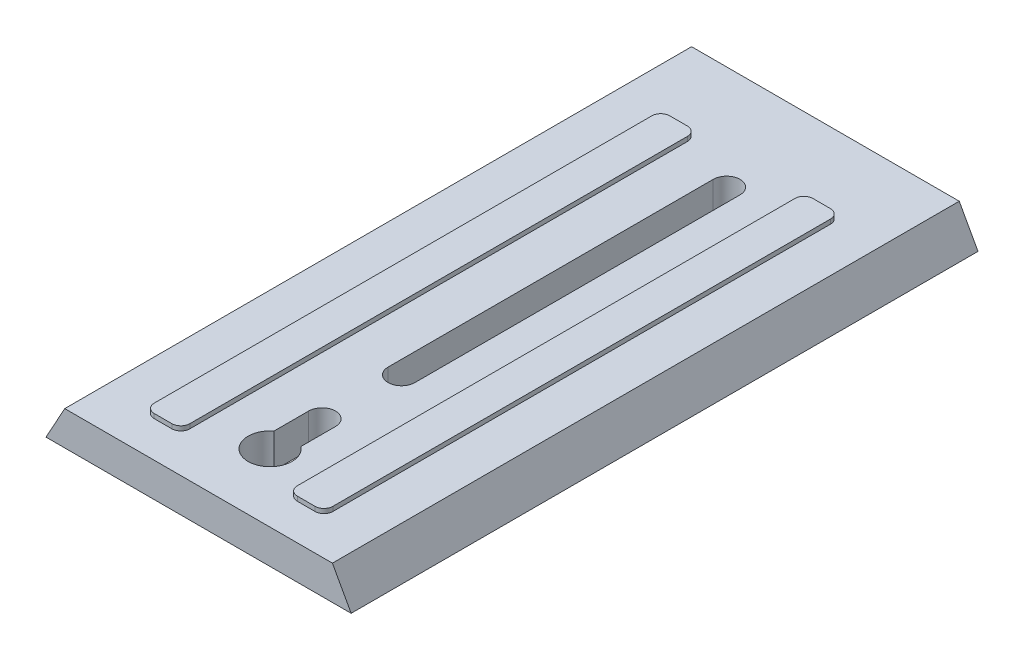
ISO-10303-21;
HEADER;
FILE_DESCRIPTION(('STEP AP214'),'2;1');
FILE_NAME('part.step','',(''),(''),'','','');
FILE_SCHEMA(('AUTOMOTIVE_DESIGN { 1 0 10303 214 1 1 1 1 }'));
ENDSEC;
DATA;
#1=APPLICATION_CONTEXT('core data for automotive mechanical design processes');
#2=APPLICATION_PROTOCOL_DEFINITION('international standard','automotive_design',2000,#1);
#3=PRODUCT_CONTEXT('',#1,'mechanical');
#4=PRODUCT('Part','Part','',(#3));
#5=PRODUCT_RELATED_PRODUCT_CATEGORY('part','',(#4));
#6=PRODUCT_DEFINITION_FORMATION('','',#4);
#7=PRODUCT_DEFINITION_CONTEXT('part definition',#1,'design');
#8=PRODUCT_DEFINITION('design','',#6,#7);
#9=PRODUCT_DEFINITION_SHAPE('','',#8);
#10=(LENGTH_UNIT() NAMED_UNIT(*) SI_UNIT(.MILLI.,.METRE.));
#11=(NAMED_UNIT(*) PLANE_ANGLE_UNIT() SI_UNIT($,.RADIAN.));
#12=(NAMED_UNIT(*) SI_UNIT($,.STERADIAN.) SOLID_ANGLE_UNIT());
#13=UNCERTAINTY_MEASURE_WITH_UNIT(LENGTH_MEASURE(1.E-05),#10,'distance_accuracy_value','');
#14=(GEOMETRIC_REPRESENTATION_CONTEXT(3) GLOBAL_UNCERTAINTY_ASSIGNED_CONTEXT((#13)) GLOBAL_UNIT_ASSIGNED_CONTEXT((#10,
#11,#12)) REPRESENTATION_CONTEXT('',''));
#15=CARTESIAN_POINT('',(0.,0.,0.));
#16=DIRECTION('',(0.,0.,1.));
#17=DIRECTION('',(1.,0.,0.));
#18=AXIS2_PLACEMENT_3D('',#15,#16,#17);
#19=CARTESIAN_POINT('',(11.6756500616298,8.61478368652415,-121.188126289698));
#20=DIRECTION('',(0.,-1.,0.));
#21=DIRECTION('',(0.,0.,-1.));
#22=AXIS2_PLACEMENT_3D('',#19,#20,#21);
#23=PLANE('',#22);
#24=DIRECTION('',(1.,0.,0.));
#25=VECTOR('',#24,1.);
#26=CARTESIAN_POINT('',(7.72886498412935,8.61478368652415,-123.188126289698));
#27=LINE('',#26,#25);
#28=CARTESIAN_POINT('',(11.6756500616298,8.61478368652415,-123.188126289698));
#29=VERTEX_POINT('',#28);
#30=CARTESIAN_POINT('',(7.72886498412934,8.61478368652415,-123.188126289698));
#31=VERTEX_POINT('',#30);
#32=EDGE_CURVE('E197',#29,#31,#27,.F.);
#33=ORIENTED_EDGE('',*,*,#32,.T.);
#34=CARTESIAN_POINT('',(7.72886498412934,8.61478368652415,-121.188126289698));
#35=DIRECTION('',(0.,-1.,0.));
#36=DIRECTION('',(0.,0.,-1.));
#37=AXIS2_PLACEMENT_3D('',#34,#35,#36);
#38=CIRCLE('',#37,2.);
#39=CARTESIAN_POINT('',(5.72886498412933,8.61478368652415,-121.188126289698));
#40=VERTEX_POINT('',#39);
#41=EDGE_CURVE('E324',#40,#31,#38,.T.);
#42=ORIENTED_EDGE('',*,*,#41,.F.);
#43=DIRECTION('',(0.,0.,-1.));
#44=VECTOR('',#43,1.);
#45=CARTESIAN_POINT('',(5.72886498412933,8.61478368652415,-121.188126289698));
#46=LINE('',#45,#44);
#47=CARTESIAN_POINT('',(5.72886498412933,8.61478368652415,-10.0480402779136));
#48=VERTEX_POINT('',#47);
#49=EDGE_CURVE('E244',#40,#48,#46,.F.);
#50=ORIENTED_EDGE('',*,*,#49,.T.);
#51=CARTESIAN_POINT('',(7.72886498412934,8.61478368652415,-10.0480402779136));
#52=DIRECTION('',(0.,-1.,0.));
#53=DIRECTION('',(0.,0.,-1.));
#54=AXIS2_PLACEMENT_3D('',#51,#52,#53);
#55=CIRCLE('',#54,2.);
#56=CARTESIAN_POINT('',(7.72886498412934,8.61478368652415,-8.04804027791362));
#57=VERTEX_POINT('',#56);
#58=EDGE_CURVE('E247',#57,#48,#55,.T.);
#59=ORIENTED_EDGE('',*,*,#58,.F.);
#60=DIRECTION('',(-1.,0.,0.));
#61=VECTOR('',#60,1.);
#62=CARTESIAN_POINT('',(7.72886498412935,8.61478368652415,-8.04804027791362));
#63=LINE('',#62,#61);
#64=CARTESIAN_POINT('',(11.6756500616298,8.61478368652415,-8.04804027791362));
#65=VERTEX_POINT('',#64);
#66=EDGE_CURVE('E248',#57,#65,#63,.F.);
#67=ORIENTED_EDGE('',*,*,#66,.T.);
#68=CARTESIAN_POINT('',(11.6756500616298,8.61478368652415,-10.0480402779136));
#69=DIRECTION('',(0.,-1.,0.));
#70=DIRECTION('',(0.,0.,-1.));
#71=AXIS2_PLACEMENT_3D('',#68,#69,#70);
#72=CIRCLE('',#71,2.);
#73=CARTESIAN_POINT('',(13.6756500616298,8.61478368652415,-10.0480402779136));
#74=VERTEX_POINT('',#73);
#75=EDGE_CURVE('E206',#74,#65,#72,.T.);
#76=ORIENTED_EDGE('',*,*,#75,.F.);
#77=DIRECTION('',(0.,0.,1.));
#78=VECTOR('',#77,1.);
#79=CARTESIAN_POINT('',(13.6756500616298,8.61478368652415,-121.188126289698));
#80=LINE('',#79,#78);
#81=CARTESIAN_POINT('',(13.6756500616298,8.61478368652415,-121.188126289698));
#82=VERTEX_POINT('',#81);
#83=EDGE_CURVE('E202',#74,#82,#80,.F.);
#84=ORIENTED_EDGE('',*,*,#83,.T.);
#85=CARTESIAN_POINT('',(11.6756500616298,8.61478368652415,-121.188126289698));
#86=DIRECTION('',(0.,-1.,0.));
#87=DIRECTION('',(0.,0.,-1.));
#88=AXIS2_PLACEMENT_3D('',#85,#86,#87);
#89=CIRCLE('',#88,2.);
#90=EDGE_CURVE('E19',#29,#82,#89,.T.);
#91=ORIENTED_EDGE('',*,*,#90,.F.);
#92=EDGE_LOOP('',(#33,#42,#50,#59,#67,#76,#84,#91));
#93=FACE_BOUND('',#92,.T.);
#94=ADVANCED_FACE('F16',(#93),#23,.F.);
#95=CARTESIAN_POINT('',(43.6393855955759,8.61478368652415,-121.188126289698));
#96=DIRECTION('',(0.,-1.,0.));
#97=DIRECTION('',(0.,0.,-1.));
#98=AXIS2_PLACEMENT_3D('',#95,#96,#97);
#99=PLANE('',#98);
#100=DIRECTION('',(1.,0.,0.));
#101=VECTOR('',#100,1.);
#102=CARTESIAN_POINT('',(43.6393855955759,8.61478368652415,-123.188126289698));
#103=LINE('',#102,#101);
#104=CARTESIAN_POINT('',(43.6393855955759,8.61478368652415,-123.188126289698));
#105=VERTEX_POINT('',#104);
#106=CARTESIAN_POINT('',(39.6926005180755,8.61478368652415,-123.188126289698));
#107=VERTEX_POINT('',#106);
#108=EDGE_CURVE('E227',#105,#107,#103,.F.);
#109=ORIENTED_EDGE('',*,*,#108,.T.);
#110=CARTESIAN_POINT('',(39.6926005180755,8.61478368652415,-121.188126289698));
#111=DIRECTION('',(0.,-1.,0.));
#112=DIRECTION('',(0.,0.,-1.));
#113=AXIS2_PLACEMENT_3D('',#110,#111,#112);
#114=CIRCLE('',#113,2.);
#115=CARTESIAN_POINT('',(37.6926005180755,8.61478368652415,-121.188126289698));
#116=VERTEX_POINT('',#115);
#117=EDGE_CURVE('E311',#116,#107,#114,.T.);
#118=ORIENTED_EDGE('',*,*,#117,.F.);
#119=DIRECTION('',(0.,0.,-1.));
#120=VECTOR('',#119,1.);
#121=CARTESIAN_POINT('',(37.6926005180755,8.61478368652415,-121.188126289698));
#122=LINE('',#121,#120);
#123=CARTESIAN_POINT('',(37.6926005180755,8.61478368652415,-10.0480402779136));
#124=VERTEX_POINT('',#123);
#125=EDGE_CURVE('E231',#116,#124,#122,.F.);
#126=ORIENTED_EDGE('',*,*,#125,.T.);
#127=CARTESIAN_POINT('',(39.6926005180755,8.61478368652415,-10.0480402779136));
#128=DIRECTION('',(0.,-1.,0.));
#129=DIRECTION('',(0.,0.,-1.));
#130=AXIS2_PLACEMENT_3D('',#127,#128,#129);
#131=CIRCLE('',#130,2.);
#132=CARTESIAN_POINT('',(39.6926005180755,8.61478368652415,-8.04804027791362));
#133=VERTEX_POINT('',#132);
#134=EDGE_CURVE('E234',#133,#124,#131,.T.);
#135=ORIENTED_EDGE('',*,*,#134,.F.);
#136=DIRECTION('',(-1.,0.,0.));
#137=VECTOR('',#136,1.);
#138=CARTESIAN_POINT('',(43.6393855955759,8.61478368652415,-8.04804027791362));
#139=LINE('',#138,#137);
#140=CARTESIAN_POINT('',(43.6393855955759,8.61478368652415,-8.04804027791362));
#141=VERTEX_POINT('',#140);
#142=EDGE_CURVE('E235',#133,#141,#139,.F.);
#143=ORIENTED_EDGE('',*,*,#142,.T.);
#144=CARTESIAN_POINT('',(43.6393855955759,8.61478368652415,-10.0480402779136));
#145=DIRECTION('',(0.,-1.,0.));
#146=DIRECTION('',(0.,0.,-1.));
#147=AXIS2_PLACEMENT_3D('',#144,#145,#146);
#148=CIRCLE('',#147,2.);
#149=CARTESIAN_POINT('',(45.6393855955759,8.61478368652415,-10.0480402779136));
#150=VERTEX_POINT('',#149);
#151=EDGE_CURVE('E238',#150,#141,#148,.T.);
#152=ORIENTED_EDGE('',*,*,#151,.F.);
#153=DIRECTION('',(0.,0.,1.));
#154=VECTOR('',#153,1.);
#155=CARTESIAN_POINT('',(45.6393855955759,8.61478368652415,-121.188126289698));
#156=LINE('',#155,#154);
#157=CARTESIAN_POINT('',(45.6393855955759,8.61478368652415,-121.188126289698));
#158=VERTEX_POINT('',#157);
#159=EDGE_CURVE('E239',#150,#158,#156,.F.);
#160=ORIENTED_EDGE('',*,*,#159,.T.);
#161=CARTESIAN_POINT('',(43.6393855955759,8.61478368652415,-121.188126289698));
#162=DIRECTION('',(0.,-1.,0.));
#163=DIRECTION('',(0.,0.,-1.));
#164=AXIS2_PLACEMENT_3D('',#161,#162,#163);
#165=CIRCLE('',#164,2.);
#166=EDGE_CURVE('E242',#105,#158,#165,.T.);
#167=ORIENTED_EDGE('',*,*,#166,.F.);
#168=EDGE_LOOP('',(#109,#118,#126,#135,#143,#152,#160,#167));
#169=FACE_BOUND('',#168,.T.);
#170=ADVANCED_FACE('F728',(#169),#99,.F.);
#171=CARTESIAN_POINT('',(7.72886498412935,8.61478368652415,-123.188126289698));
#172=DIRECTION('',(0.,0.,1.));
#173=DIRECTION('',(1.,0.,0.));
#174=AXIS2_PLACEMENT_3D('',#171,#172,#173);
#175=PLANE('',#174);
#176=DIRECTION('',(0.,-1.,0.));
#177=VECTOR('',#176,1.);
#178=CARTESIAN_POINT('',(7.72886498412934,8.61478368652415,-123.188126289698));
#179=LINE('',#178,#177);
#180=CARTESIAN_POINT('',(7.72886498412934,7.61478368652415,-123.188126289698));
#181=VERTEX_POINT('',#180);
#182=EDGE_CURVE('E230',#31,#181,#179,.T.);
#183=ORIENTED_EDGE('',*,*,#182,.F.);
#184=ORIENTED_EDGE('',*,*,#32,.F.);
#185=DIRECTION('',(0.,-1.,0.));
#186=VECTOR('',#185,1.);
#187=CARTESIAN_POINT('',(11.6756500616298,8.61478368652415,-123.188126289698));
#188=LINE('',#187,#186);
#189=CARTESIAN_POINT('',(11.6756500616298,7.61478368652415,-123.188126289698));
#190=VERTEX_POINT('',#189);
#191=EDGE_CURVE('E216',#190,#29,#188,.F.);
#192=ORIENTED_EDGE('',*,*,#191,.F.);
#193=DIRECTION('',(1.,0.,0.));
#194=VECTOR('',#193,1.);
#195=CARTESIAN_POINT('',(-4.20551489691764,7.61478368652415,-123.188126289698));
#196=LINE('',#195,#194);
#197=EDGE_CURVE('E310',#181,#190,#196,.T.);
#198=ORIENTED_EDGE('',*,*,#197,.F.);
#199=EDGE_LOOP('',(#183,#184,#192,#198));
#200=FACE_BOUND('',#199,.T.);
#201=ADVANCED_FACE('F719',(#200),#175,.F.);
#202=CARTESIAN_POINT('',(11.6756500616298,8.61478368652415,-121.188126289698));
#203=DIRECTION('',(0.,-1.,0.));
#204=DIRECTION('',(0.,0.,-1.));
#205=AXIS2_PLACEMENT_3D('',#202,#203,#204);
#206=CYLINDRICAL_SURFACE('',#205,2.);
#207=ORIENTED_EDGE('',*,*,#90,.T.);
#208=DIRECTION('',(0.,1.,0.));
#209=VECTOR('',#208,1.);
#210=CARTESIAN_POINT('',(13.6756500616298,8.61478368652415,-121.188126289698));
#211=LINE('',#210,#209);
#212=CARTESIAN_POINT('',(13.6756500616298,7.61478368652415,-121.188126289698));
#213=VERTEX_POINT('',#212);
#214=EDGE_CURVE('E210',#82,#213,#211,.F.);
#215=ORIENTED_EDGE('',*,*,#214,.T.);
#216=CARTESIAN_POINT('',(11.6756500616298,7.61478368652415,-121.188126289698));
#217=DIRECTION('',(0.,-1.,0.));
#218=DIRECTION('',(0.,0.,-1.));
#219=AXIS2_PLACEMENT_3D('',#216,#217,#218);
#220=CIRCLE('',#219,2.);
#221=EDGE_CURVE('E308',#190,#213,#220,.T.);
#222=ORIENTED_EDGE('',*,*,#221,.F.);
#223=ORIENTED_EDGE('',*,*,#191,.T.);
#224=EDGE_LOOP('',(#207,#215,#222,#223));
#225=FACE_BOUND('',#224,.T.);
#226=ADVANCED_FACE('F213',(#225),#206,.T.);
#227=CARTESIAN_POINT('',(13.6756500616298,8.61478368652415,-121.188126289698));
#228=DIRECTION('',(-1.,0.,0.));
#229=DIRECTION('',(0.,0.,1.));
#230=AXIS2_PLACEMENT_3D('',#227,#228,#229);
#231=PLANE('',#230);
#232=ORIENTED_EDGE('',*,*,#214,.F.);
#233=ORIENTED_EDGE('',*,*,#83,.F.);
#234=DIRECTION('',(0.,-1.,0.));
#235=VECTOR('',#234,1.);
#236=CARTESIAN_POINT('',(13.6756500616298,8.61478368652415,-10.0480402779136));
#237=LINE('',#236,#235);
#238=CARTESIAN_POINT('',(13.6756500616298,7.61478368652415,-10.0480402779136));
#239=VERTEX_POINT('',#238);
#240=EDGE_CURVE('E221',#239,#74,#237,.F.);
#241=ORIENTED_EDGE('',*,*,#240,.F.);
#242=DIRECTION('',(0.,0.,1.));
#243=VECTOR('',#242,1.);
#244=CARTESIAN_POINT('',(13.6756500616298,7.61478368652415,-140.));
#245=LINE('',#244,#243);
#246=EDGE_CURVE('E219',#213,#239,#245,.T.);
#247=ORIENTED_EDGE('',*,*,#246,.F.);
#248=EDGE_LOOP('',(#232,#233,#241,#247));
#249=FACE_BOUND('',#248,.T.);
#250=ADVANCED_FACE('F217',(#249),#231,.F.);
#251=CARTESIAN_POINT('',(11.6756500616298,8.61478368652415,-10.0480402779136));
#252=DIRECTION('',(0.,-1.,0.));
#253=DIRECTION('',(0.,0.,-1.));
#254=AXIS2_PLACEMENT_3D('',#251,#252,#253);
#255=CYLINDRICAL_SURFACE('',#254,2.);
#256=ORIENTED_EDGE('',*,*,#75,.T.);
#257=DIRECTION('',(0.,1.,0.));
#258=VECTOR('',#257,1.);
#259=CARTESIAN_POINT('',(11.6756500616298,8.61478368652415,-8.04804027791362));
#260=LINE('',#259,#258);
#261=CARTESIAN_POINT('',(11.6756500616298,7.61478368652415,-8.04804027791362));
#262=VERTEX_POINT('',#261);
#263=EDGE_CURVE('E249',#65,#262,#260,.F.);
#264=ORIENTED_EDGE('',*,*,#263,.T.);
#265=CARTESIAN_POINT('',(11.6756500616298,7.61478368652415,-10.0480402779136));
#266=DIRECTION('',(0.,-1.,0.));
#267=DIRECTION('',(0.,0.,-1.));
#268=AXIS2_PLACEMENT_3D('',#265,#266,#267);
#269=CIRCLE('',#268,2.);
#270=EDGE_CURVE('E305',#239,#262,#269,.T.);
#271=ORIENTED_EDGE('',*,*,#270,.F.);
#272=ORIENTED_EDGE('',*,*,#240,.T.);
#273=EDGE_LOOP('',(#256,#264,#271,#272));
#274=FACE_BOUND('',#273,.T.);
#275=ADVANCED_FACE('F332',(#274),#255,.T.);
#276=CARTESIAN_POINT('',(7.72886498412935,8.61478368652415,-8.04804027791362));
#277=DIRECTION('',(0.,0.,-1.));
#278=DIRECTION('',(-1.,0.,0.));
#279=AXIS2_PLACEMENT_3D('',#276,#277,#278);
#280=PLANE('',#279);
#281=ORIENTED_EDGE('',*,*,#263,.F.);
#282=ORIENTED_EDGE('',*,*,#66,.F.);
#283=DIRECTION('',(0.,-1.,0.));
#284=VECTOR('',#283,1.);
#285=CARTESIAN_POINT('',(7.72886498412935,8.61478368652415,-8.04804027791362));
#286=LINE('',#285,#284);
#287=CARTESIAN_POINT('',(7.72886498412934,7.61478368652415,-8.04804027791362));
#288=VERTEX_POINT('',#287);
#289=EDGE_CURVE('E329',#288,#57,#286,.F.);
#290=ORIENTED_EDGE('',*,*,#289,.F.);
#291=DIRECTION('',(1.,0.,0.));
#292=VECTOR('',#291,1.);
#293=CARTESIAN_POINT('',(-4.20551489691764,7.61478368652415,-8.04804027791361));
#294=LINE('',#293,#292);
#295=EDGE_CURVE('E304',#262,#288,#294,.F.);
#296=ORIENTED_EDGE('',*,*,#295,.F.);
#297=EDGE_LOOP('',(#281,#282,#290,#296));
#298=FACE_BOUND('',#297,.T.);
#299=ADVANCED_FACE('F336',(#298),#280,.F.);
#300=CARTESIAN_POINT('',(7.72886498412934,8.61478368652415,-10.0480402779136));
#301=DIRECTION('',(0.,-1.,0.));
#302=DIRECTION('',(0.,0.,-1.));
#303=AXIS2_PLACEMENT_3D('',#300,#301,#302);
#304=CYLINDRICAL_SURFACE('',#303,2.);
#305=ORIENTED_EDGE('',*,*,#58,.T.);
#306=DIRECTION('',(0.,1.,0.));
#307=VECTOR('',#306,1.);
#308=CARTESIAN_POINT('',(5.72886498412933,8.61478368652415,-10.0480402779136));
#309=LINE('',#308,#307);
#310=CARTESIAN_POINT('',(5.72886498412933,7.61478368652415,-10.0480402779136));
#311=VERTEX_POINT('',#310);
#312=EDGE_CURVE('E246',#48,#311,#309,.F.);
#313=ORIENTED_EDGE('',*,*,#312,.T.);
#314=CARTESIAN_POINT('',(7.72886498412934,7.61478368652415,-10.0480402779136));
#315=DIRECTION('',(0.,-1.,0.));
#316=DIRECTION('',(0.,0.,-1.));
#317=AXIS2_PLACEMENT_3D('',#314,#315,#316);
#318=CIRCLE('',#317,2.);
#319=EDGE_CURVE('E301',#288,#311,#318,.T.);
#320=ORIENTED_EDGE('',*,*,#319,.F.);
#321=ORIENTED_EDGE('',*,*,#289,.T.);
#322=EDGE_LOOP('',(#305,#313,#320,#321));
#323=FACE_BOUND('',#322,.T.);
#324=ADVANCED_FACE('F676',(#323),#304,.T.);
#325=CARTESIAN_POINT('',(5.72886498412933,8.61478368652415,-121.188126289698));
#326=DIRECTION('',(1.,0.,0.));
#327=DIRECTION('',(0.,0.,-1.));
#328=AXIS2_PLACEMENT_3D('',#325,#326,#327);
#329=PLANE('',#328);
#330=ORIENTED_EDGE('',*,*,#312,.F.);
#331=ORIENTED_EDGE('',*,*,#49,.F.);
#332=DIRECTION('',(0.,-1.,0.));
#333=VECTOR('',#332,1.);
#334=CARTESIAN_POINT('',(5.72886498412933,8.61478368652415,-121.188126289698));
#335=LINE('',#334,#333);
#336=CARTESIAN_POINT('',(5.72886498412933,7.61478368652415,-121.188126289698));
#337=VERTEX_POINT('',#336);
#338=EDGE_CURVE('E327',#337,#40,#335,.F.);
#339=ORIENTED_EDGE('',*,*,#338,.F.);
#340=DIRECTION('',(0.,0.,1.));
#341=VECTOR('',#340,1.);
#342=CARTESIAN_POINT('',(5.72886498412933,7.61478368652415,-140.));
#343=LINE('',#342,#341);
#344=EDGE_CURVE('E300',#311,#337,#343,.F.);
#345=ORIENTED_EDGE('',*,*,#344,.F.);
#346=EDGE_LOOP('',(#330,#331,#339,#345));
#347=FACE_BOUND('',#346,.T.);
#348=ADVANCED_FACE('F666',(#347),#329,.F.);
#349=CARTESIAN_POINT('',(7.72886498412934,8.61478368652415,-121.188126289698));
#350=DIRECTION('',(0.,-1.,0.));
#351=DIRECTION('',(0.,0.,-1.));
#352=AXIS2_PLACEMENT_3D('',#349,#350,#351);
#353=CYLINDRICAL_SURFACE('',#352,2.);
#354=ORIENTED_EDGE('',*,*,#41,.T.);
#355=ORIENTED_EDGE('',*,*,#182,.T.);
#356=CARTESIAN_POINT('',(7.72886498412934,7.61478368652415,-121.188126289698));
#357=DIRECTION('',(0.,-1.,0.));
#358=DIRECTION('',(0.,0.,-1.));
#359=AXIS2_PLACEMENT_3D('',#356,#357,#358);
#360=CIRCLE('',#359,2.);
#361=EDGE_CURVE('E297',#337,#181,#360,.T.);
#362=ORIENTED_EDGE('',*,*,#361,.F.);
#363=ORIENTED_EDGE('',*,*,#338,.T.);
#364=EDGE_LOOP('',(#354,#355,#362,#363));
#365=FACE_BOUND('',#364,.T.);
#366=ADVANCED_FACE('F656',(#365),#353,.T.);
#367=CARTESIAN_POINT('',(43.6393855955759,8.61478368652415,-123.188126289698));
#368=DIRECTION('',(0.,0.,1.));
#369=DIRECTION('',(1.,0.,0.));
#370=AXIS2_PLACEMENT_3D('',#367,#368,#369);
#371=PLANE('',#370);
#372=DIRECTION('',(0.,-1.,0.));
#373=VECTOR('',#372,1.);
#374=CARTESIAN_POINT('',(39.6926005180755,8.61478368652415,-123.188126289698));
#375=LINE('',#374,#373);
#376=CARTESIAN_POINT('',(39.6926005180755,7.61478368652415,-123.188126289698));
#377=VERTEX_POINT('',#376);
#378=EDGE_CURVE('E314',#107,#377,#375,.T.);
#379=ORIENTED_EDGE('',*,*,#378,.F.);
#380=ORIENTED_EDGE('',*,*,#108,.F.);
#381=DIRECTION('',(0.,-1.,0.));
#382=VECTOR('',#381,1.);
#383=CARTESIAN_POINT('',(43.6393855955759,8.61478368652415,-123.188126289698));
#384=LINE('',#383,#382);
#385=CARTESIAN_POINT('',(43.6393855955759,7.61478368652415,-123.188126289698));
#386=VERTEX_POINT('',#385);
#387=EDGE_CURVE('E229',#386,#105,#384,.F.);
#388=ORIENTED_EDGE('',*,*,#387,.F.);
#389=DIRECTION('',(1.,0.,0.));
#390=VECTOR('',#389,1.);
#391=CARTESIAN_POINT('',(-4.20551489691764,7.61478368652415,-123.188126289698));
#392=LINE('',#391,#390);
#393=EDGE_CURVE('E296',#377,#386,#392,.T.);
#394=ORIENTED_EDGE('',*,*,#393,.F.);
#395=EDGE_LOOP('',(#379,#380,#388,#394));
#396=FACE_BOUND('',#395,.T.);
#397=ADVANCED_FACE('F646',(#396),#371,.F.);
#398=CARTESIAN_POINT('',(43.6393855955759,8.61478368652415,-121.188126289698));
#399=DIRECTION('',(0.,-1.,0.));
#400=DIRECTION('',(0.,0.,-1.));
#401=AXIS2_PLACEMENT_3D('',#398,#399,#400);
#402=CYLINDRICAL_SURFACE('',#401,2.);
#403=ORIENTED_EDGE('',*,*,#166,.T.);
#404=DIRECTION('',(0.,1.,0.));
#405=VECTOR('',#404,1.);
#406=CARTESIAN_POINT('',(45.6393855955759,8.61478368652415,-121.188126289698));
#407=LINE('',#406,#405);
#408=CARTESIAN_POINT('',(45.6393855955759,7.61478368652415,-121.188126289698));
#409=VERTEX_POINT('',#408);
#410=EDGE_CURVE('E241',#158,#409,#407,.F.);
#411=ORIENTED_EDGE('',*,*,#410,.T.);
#412=CARTESIAN_POINT('',(43.6393855955759,7.61478368652415,-121.188126289698));
#413=DIRECTION('',(0.,-1.,0.));
#414=DIRECTION('',(0.,0.,-1.));
#415=AXIS2_PLACEMENT_3D('',#412,#413,#414);
#416=CIRCLE('',#415,2.);
#417=EDGE_CURVE('E293',#386,#409,#416,.T.);
#418=ORIENTED_EDGE('',*,*,#417,.F.);
#419=ORIENTED_EDGE('',*,*,#387,.T.);
#420=EDGE_LOOP('',(#403,#411,#418,#419));
#421=FACE_BOUND('',#420,.T.);
#422=ADVANCED_FACE('F636',(#421),#402,.T.);
#423=CARTESIAN_POINT('',(45.6393855955759,8.61478368652415,-121.188126289698));
#424=DIRECTION('',(-1.,0.,0.));
#425=DIRECTION('',(0.,0.,1.));
#426=AXIS2_PLACEMENT_3D('',#423,#424,#425);
#427=PLANE('',#426);
#428=ORIENTED_EDGE('',*,*,#410,.F.);
#429=ORIENTED_EDGE('',*,*,#159,.F.);
#430=DIRECTION('',(0.,-1.,0.));
#431=VECTOR('',#430,1.);
#432=CARTESIAN_POINT('',(45.6393855955759,8.61478368652415,-10.0480402779136));
#433=LINE('',#432,#431);
#434=CARTESIAN_POINT('',(45.6393855955759,7.61478368652415,-10.0480402779136));
#435=VERTEX_POINT('',#434);
#436=EDGE_CURVE('E321',#435,#150,#433,.F.);
#437=ORIENTED_EDGE('',*,*,#436,.F.);
#438=DIRECTION('',(0.,0.,1.));
#439=VECTOR('',#438,1.);
#440=CARTESIAN_POINT('',(45.6393855955759,7.61478368652415,-140.));
#441=LINE('',#440,#439);
#442=EDGE_CURVE('E292',#409,#435,#441,.T.);
#443=ORIENTED_EDGE('',*,*,#442,.F.);
#444=EDGE_LOOP('',(#428,#429,#437,#443));
#445=FACE_BOUND('',#444,.T.);
#446=ADVANCED_FACE('F626',(#445),#427,.F.);
#447=CARTESIAN_POINT('',(43.6393855955759,8.61478368652415,-10.0480402779136));
#448=DIRECTION('',(0.,-1.,0.));
#449=DIRECTION('',(0.,0.,-1.));
#450=AXIS2_PLACEMENT_3D('',#447,#448,#449);
#451=CYLINDRICAL_SURFACE('',#450,2.);
#452=ORIENTED_EDGE('',*,*,#151,.T.);
#453=DIRECTION('',(0.,1.,0.));
#454=VECTOR('',#453,1.);
#455=CARTESIAN_POINT('',(43.6393855955759,8.61478368652415,-8.04804027791362));
#456=LINE('',#455,#454);
#457=CARTESIAN_POINT('',(43.6393855955759,7.61478368652415,-8.04804027791362));
#458=VERTEX_POINT('',#457);
#459=EDGE_CURVE('E237',#141,#458,#456,.F.);
#460=ORIENTED_EDGE('',*,*,#459,.T.);
#461=CARTESIAN_POINT('',(43.6393855955759,7.61478368652415,-10.0480402779136));
#462=DIRECTION('',(0.,-1.,0.));
#463=DIRECTION('',(0.,0.,-1.));
#464=AXIS2_PLACEMENT_3D('',#461,#462,#463);
#465=CIRCLE('',#464,2.);
#466=EDGE_CURVE('E289',#435,#458,#465,.T.);
#467=ORIENTED_EDGE('',*,*,#466,.F.);
#468=ORIENTED_EDGE('',*,*,#436,.T.);
#469=EDGE_LOOP('',(#452,#460,#467,#468));
#470=FACE_BOUND('',#469,.T.);
#471=ADVANCED_FACE('F616',(#470),#451,.T.);
#472=CARTESIAN_POINT('',(43.6393855955759,8.61478368652415,-8.04804027791362));
#473=DIRECTION('',(0.,0.,-1.));
#474=DIRECTION('',(-1.,0.,0.));
#475=AXIS2_PLACEMENT_3D('',#472,#473,#474);
#476=PLANE('',#475);
#477=ORIENTED_EDGE('',*,*,#459,.F.);
#478=ORIENTED_EDGE('',*,*,#142,.F.);
#479=DIRECTION('',(0.,-1.,0.));
#480=VECTOR('',#479,1.);
#481=CARTESIAN_POINT('',(39.6926005180755,8.61478368652415,-8.04804027791362));
#482=LINE('',#481,#480);
#483=CARTESIAN_POINT('',(39.6926005180755,7.61478368652415,-8.04804027791362));
#484=VERTEX_POINT('',#483);
#485=EDGE_CURVE('E318',#484,#133,#482,.F.);
#486=ORIENTED_EDGE('',*,*,#485,.F.);
#487=DIRECTION('',(1.,0.,0.));
#488=VECTOR('',#487,1.);
#489=CARTESIAN_POINT('',(-4.20551489691764,7.61478368652415,-8.04804027791361));
#490=LINE('',#489,#488);
#491=EDGE_CURVE('E288',#458,#484,#490,.F.);
#492=ORIENTED_EDGE('',*,*,#491,.F.);
#493=EDGE_LOOP('',(#477,#478,#486,#492));
#494=FACE_BOUND('',#493,.T.);
#495=ADVANCED_FACE('F606',(#494),#476,.F.);
#496=CARTESIAN_POINT('',(39.6926005180755,8.61478368652415,-10.0480402779136));
#497=DIRECTION('',(0.,-1.,0.));
#498=DIRECTION('',(0.,0.,-1.));
#499=AXIS2_PLACEMENT_3D('',#496,#497,#498);
#500=CYLINDRICAL_SURFACE('',#499,2.);
#501=ORIENTED_EDGE('',*,*,#134,.T.);
#502=DIRECTION('',(0.,1.,0.));
#503=VECTOR('',#502,1.);
#504=CARTESIAN_POINT('',(37.6926005180755,8.61478368652415,-10.0480402779136));
#505=LINE('',#504,#503);
#506=CARTESIAN_POINT('',(37.6926005180755,7.61478368652415,-10.0480402779136));
#507=VERTEX_POINT('',#506);
#508=EDGE_CURVE('E233',#124,#507,#505,.F.);
#509=ORIENTED_EDGE('',*,*,#508,.T.);
#510=CARTESIAN_POINT('',(39.6926005180755,7.61478368652415,-10.0480402779136));
#511=DIRECTION('',(0.,-1.,0.));
#512=DIRECTION('',(0.,0.,-1.));
#513=AXIS2_PLACEMENT_3D('',#510,#511,#512);
#514=CIRCLE('',#513,2.);
#515=EDGE_CURVE('E285',#484,#507,#514,.T.);
#516=ORIENTED_EDGE('',*,*,#515,.F.);
#517=ORIENTED_EDGE('',*,*,#485,.T.);
#518=EDGE_LOOP('',(#501,#509,#516,#517));
#519=FACE_BOUND('',#518,.T.);
#520=ADVANCED_FACE('F596',(#519),#500,.T.);
#521=CARTESIAN_POINT('',(37.6926005180755,8.61478368652415,-121.188126289698));
#522=DIRECTION('',(1.,0.,0.));
#523=DIRECTION('',(0.,0.,-1.));
#524=AXIS2_PLACEMENT_3D('',#521,#522,#523);
#525=PLANE('',#524);
#526=ORIENTED_EDGE('',*,*,#508,.F.);
#527=ORIENTED_EDGE('',*,*,#125,.F.);
#528=DIRECTION('',(0.,-1.,0.));
#529=VECTOR('',#528,1.);
#530=CARTESIAN_POINT('',(37.6926005180755,8.61478368652415,-121.188126289698));
#531=LINE('',#530,#529);
#532=CARTESIAN_POINT('',(37.6926005180755,7.61478368652415,-121.188126289698));
#533=VERTEX_POINT('',#532);
#534=EDGE_CURVE('E315',#533,#116,#531,.F.);
#535=ORIENTED_EDGE('',*,*,#534,.F.);
#536=DIRECTION('',(0.,0.,1.));
#537=VECTOR('',#536,1.);
#538=CARTESIAN_POINT('',(37.6926005180755,7.61478368652415,-140.));
#539=LINE('',#538,#537);
#540=EDGE_CURVE('E284',#507,#533,#539,.F.);
#541=ORIENTED_EDGE('',*,*,#540,.F.);
#542=EDGE_LOOP('',(#526,#527,#535,#541));
#543=FACE_BOUND('',#542,.T.);
#544=ADVANCED_FACE('F586',(#543),#525,.F.);
#545=CARTESIAN_POINT('',(39.6926005180755,8.61478368652415,-121.188126289698));
#546=DIRECTION('',(0.,-1.,0.));
#547=DIRECTION('',(0.,0.,-1.));
#548=AXIS2_PLACEMENT_3D('',#545,#546,#547);
#549=CYLINDRICAL_SURFACE('',#548,2.);
#550=ORIENTED_EDGE('',*,*,#117,.T.);
#551=ORIENTED_EDGE('',*,*,#378,.T.);
#552=CARTESIAN_POINT('',(39.6926005180755,7.61478368652415,-121.188126289698));
#553=DIRECTION('',(0.,-1.,0.));
#554=DIRECTION('',(0.,0.,-1.));
#555=AXIS2_PLACEMENT_3D('',#552,#553,#554);
#556=CIRCLE('',#555,2.);
#557=EDGE_CURVE('E281',#533,#377,#556,.T.);
#558=ORIENTED_EDGE('',*,*,#557,.F.);
#559=ORIENTED_EDGE('',*,*,#534,.T.);
#560=EDGE_LOOP('',(#550,#551,#558,#559));
#561=FACE_BOUND('',#560,.T.);
#562=ADVANCED_FACE('F576',(#561),#549,.T.);
#563=CARTESIAN_POINT('',(-4.20551489691764,7.61478368652415,-140.));
#564=DIRECTION('',(0.,1.,0.));
#565=DIRECTION('',(0.,0.,1.));
#566=AXIS2_PLACEMENT_3D('',#563,#564,#565);
#567=PLANE('',#566);
#568=ORIENTED_EDGE('',*,*,#540,.T.);
#569=ORIENTED_EDGE('',*,*,#557,.T.);
#570=ORIENTED_EDGE('',*,*,#393,.T.);
#571=ORIENTED_EDGE('',*,*,#417,.T.);
#572=ORIENTED_EDGE('',*,*,#442,.T.);
#573=ORIENTED_EDGE('',*,*,#466,.T.);
#574=ORIENTED_EDGE('',*,*,#491,.T.);
#575=ORIENTED_EDGE('',*,*,#515,.T.);
#576=EDGE_LOOP('',(#568,#569,#570,#571,#572,#573,#574,#575));
#577=FACE_BOUND('',#576,.T.);
#578=DIRECTION('',(1.,0.,0.));
#579=VECTOR('',#578,1.);
#580=CARTESIAN_POINT('',(-8.39219961160897,7.61478368652415,-140.));
#581=LINE('',#580,#579);
#582=CARTESIAN_POINT('',(55.5737654766229,7.61478368652415,-140.));
#583=VERTEX_POINT('',#582);
#584=CARTESIAN_POINT('',(-4.20551489691764,7.61478368652415,-140.));
#585=VERTEX_POINT('',#584);
#586=EDGE_CURVE('E407',#583,#585,#581,.F.);
#587=ORIENTED_EDGE('',*,*,#586,.T.);
#588=DIRECTION('',(0.,0.,1.));
#589=VECTOR('',#588,1.);
#590=CARTESIAN_POINT('',(-4.20551489691764,7.61478368652415,-140.));
#591=LINE('',#590,#589);
#592=CARTESIAN_POINT('',(-4.20551489691764,7.61478368652415,0.));
#593=VERTEX_POINT('',#592);
#594=EDGE_CURVE('E404',#593,#585,#591,.F.);
#595=ORIENTED_EDGE('',*,*,#594,.F.);
#596=DIRECTION('',(1.,0.,0.));
#597=VECTOR('',#596,1.);
#598=CARTESIAN_POINT('',(-8.39219961160897,7.61478368652415,0.));
#599=LINE('',#598,#597);
#600=CARTESIAN_POINT('',(55.5737654766229,7.61478368652415,0.));
#601=VERTEX_POINT('',#600);
#602=EDGE_CURVE('E372',#601,#593,#599,.F.);
#603=ORIENTED_EDGE('',*,*,#602,.F.);
#604=DIRECTION('',(0.,0.,1.));
#605=VECTOR('',#604,1.);
#606=CARTESIAN_POINT('',(55.5737654766229,7.61478368652415,-140.));
#607=LINE('',#606,#605);
#608=EDGE_CURVE('E265',#583,#601,#607,.T.);
#609=ORIENTED_EDGE('',*,*,#608,.F.);
#610=EDGE_LOOP('',(#587,#595,#603,#609));
#611=FACE_BOUND('',#610,.T.);
#612=CARTESIAN_POINT('',(26.5,7.61478368652415,-26.7671340160257));
#613=DIRECTION('',(0.,-1.,0.));
#614=DIRECTION('',(0.,0.,-1.));
#615=AXIS2_PLACEMENT_3D('',#612,#613,#614);
#616=CIRCLE('',#615,3.);
#617=CARTESIAN_POINT('',(23.5,7.61478368652416,-26.7671340160257));
#618=VERTEX_POINT('',#617);
#619=CARTESIAN_POINT('',(29.5,7.61478368652416,-26.7671340160257));
#620=VERTEX_POINT('',#619);
#621=EDGE_CURVE('E266',#618,#620,#616,.T.);
#622=ORIENTED_EDGE('',*,*,#621,.T.);
#623=DIRECTION('',(0.,0.,-1.));
#624=VECTOR('',#623,1.);
#625=CARTESIAN_POINT('',(29.5,7.61478368652416,-19.0366483544257));
#626=LINE('',#625,#624);
#627=CARTESIAN_POINT('',(29.5,7.61478368652416,-19.0366483544257));
#628=VERTEX_POINT('',#627);
#629=EDGE_CURVE('E366',#620,#628,#626,.F.);
#630=ORIENTED_EDGE('',*,*,#629,.T.);
#631=CARTESIAN_POINT('',(26.5,7.61478368652416,-15.1527207884596));
#632=DIRECTION('',(0.,-1.,0.));
#633=DIRECTION('',(0.,0.,-1.));
#634=AXIS2_PLACEMENT_3D('',#631,#632,#633);
#635=CIRCLE('',#634,4.90763622711298);
#636=CARTESIAN_POINT('',(23.5,7.61478368652416,-19.0366483544257));
#637=VERTEX_POINT('',#636);
#638=EDGE_CURVE('E270',#628,#637,#635,.T.);
#639=ORIENTED_EDGE('',*,*,#638,.T.);
#640=DIRECTION('',(0.,0.,1.));
#641=VECTOR('',#640,1.);
#642=CARTESIAN_POINT('',(23.5,7.61478368652416,-19.0366483544257));
#643=LINE('',#642,#641);
#644=EDGE_CURVE('E369',#637,#618,#643,.F.);
#645=ORIENTED_EDGE('',*,*,#644,.T.);
#646=EDGE_LOOP('',(#622,#630,#639,#645));
#647=FACE_BOUND('',#646,.T.);
#648=CARTESIAN_POINT('',(26.8672012122325,7.61478368652415,-116.751640913992));
#649=DIRECTION('',(0.,-1.,0.));
#650=DIRECTION('',(0.,0.,-1.));
#651=AXIS2_PLACEMENT_3D('',#648,#649,#650);
#652=CIRCLE('',#651,3.);
#653=CARTESIAN_POINT('',(23.8672012122325,7.61478368652416,-116.751640913992));
#654=VERTEX_POINT('',#653);
#655=CARTESIAN_POINT('',(29.8672012122325,7.61478368652416,-116.751640913992));
#656=VERTEX_POINT('',#655);
#657=EDGE_CURVE('E274',#654,#656,#652,.T.);
#658=ORIENTED_EDGE('',*,*,#657,.T.);
#659=DIRECTION('',(0.,0.,-1.));
#660=VECTOR('',#659,1.);
#661=CARTESIAN_POINT('',(29.8672012122325,7.61478368652416,-44.1383521471588));
#662=LINE('',#661,#660);
#663=CARTESIAN_POINT('',(29.8672012122325,7.61478368652416,-44.1383521471588));
#664=VERTEX_POINT('',#663);
#665=EDGE_CURVE('E360',#656,#664,#662,.F.);
#666=ORIENTED_EDGE('',*,*,#665,.T.);
#667=CARTESIAN_POINT('',(26.8672012122325,7.61478368652416,-44.1383521471588));
#668=DIRECTION('',(0.,-1.,0.));
#669=DIRECTION('',(0.,0.,-1.));
#670=AXIS2_PLACEMENT_3D('',#667,#668,#669);
#671=CIRCLE('',#670,3.);
#672=CARTESIAN_POINT('',(23.8672012122325,7.61478368652416,-44.1383521471588));
#673=VERTEX_POINT('',#672);
#674=EDGE_CURVE('E278',#664,#673,#671,.T.);
#675=ORIENTED_EDGE('',*,*,#674,.T.);
#676=DIRECTION('',(0.,0.,1.));
#677=VECTOR('',#676,1.);
#678=CARTESIAN_POINT('',(23.8672012122325,7.61478368652416,-44.1383521471588));
#679=LINE('',#678,#677);
#680=EDGE_CURVE('E273',#673,#654,#679,.F.);
#681=ORIENTED_EDGE('',*,*,#680,.T.);
#682=EDGE_LOOP('',(#658,#666,#675,#681));
#683=FACE_BOUND('',#682,.T.);
#684=ORIENTED_EDGE('',*,*,#344,.T.);
#685=ORIENTED_EDGE('',*,*,#361,.T.);
#686=ORIENTED_EDGE('',*,*,#197,.T.);
#687=ORIENTED_EDGE('',*,*,#221,.T.);
#688=ORIENTED_EDGE('',*,*,#246,.T.);
#689=ORIENTED_EDGE('',*,*,#270,.T.);
#690=ORIENTED_EDGE('',*,*,#295,.T.);
#691=ORIENTED_EDGE('',*,*,#319,.T.);
#692=EDGE_LOOP('',(#684,#685,#686,#687,#688,#689,#690,#691));
#693=FACE_BOUND('',#692,.T.);
#694=ADVANCED_FACE('F443',(#577,#611,#647,#683,#693),#567,.T.);
#695=CARTESIAN_POINT('',(26.8672012122325,45.7,-44.1383521471588));
#696=DIRECTION('',(0.,-1.,0.));
#697=DIRECTION('',(0.,0.,-1.));
#698=AXIS2_PLACEMENT_3D('',#695,#696,#697);
#699=CYLINDRICAL_SURFACE('',#698,3.);
#700=DIRECTION('',(0.,1.,0.));
#701=VECTOR('',#700,1.);
#702=CARTESIAN_POINT('',(29.8672012122325,45.7,-44.1383521471588));
#703=LINE('',#702,#701);
#704=CARTESIAN_POINT('',(29.8672012122325,0.,-44.1383521471588));
#705=VERTEX_POINT('',#704);
#706=EDGE_CURVE('E280',#664,#705,#703,.F.);
#707=ORIENTED_EDGE('',*,*,#706,.T.);
#708=CARTESIAN_POINT('',(26.8672012122325,0.,-44.1383521471588));
#709=DIRECTION('',(0.,-1.,0.));
#710=DIRECTION('',(0.,0.,-1.));
#711=AXIS2_PLACEMENT_3D('',#708,#709,#710);
#712=CIRCLE('',#711,3.);
#713=CARTESIAN_POINT('',(23.8672012122325,0.,-44.1383521471588));
#714=VERTEX_POINT('',#713);
#715=EDGE_CURVE('E262',#714,#705,#712,.F.);
#716=ORIENTED_EDGE('',*,*,#715,.F.);
#717=DIRECTION('',(0.,1.,0.));
#718=VECTOR('',#717,1.);
#719=CARTESIAN_POINT('',(23.8672012122325,45.7,-44.1383521471588));
#720=LINE('',#719,#718);
#721=EDGE_CURVE('E365',#714,#673,#720,.T.);
#722=ORIENTED_EDGE('',*,*,#721,.T.);
#723=ORIENTED_EDGE('',*,*,#674,.F.);
#724=EDGE_LOOP('',(#707,#716,#722,#723));
#725=FACE_BOUND('',#724,.T.);
#726=ADVANCED_FACE('F559',(#725),#699,.F.);
#727=CARTESIAN_POINT('',(29.8672012122325,45.7,-44.1383521471588));
#728=DIRECTION('',(1.,0.,0.));
#729=DIRECTION('',(0.,0.,-1.));
#730=AXIS2_PLACEMENT_3D('',#727,#728,#729);
#731=PLANE('',#730);
#732=DIRECTION('',(0.,-1.,0.));
#733=VECTOR('',#732,1.);
#734=CARTESIAN_POINT('',(29.8672012122325,45.7,-116.751640913992));
#735=LINE('',#734,#733);
#736=CARTESIAN_POINT('',(29.8672012122325,0.,-116.751640913992));
#737=VERTEX_POINT('',#736);
#738=EDGE_CURVE('E277',#656,#737,#735,.T.);
#739=ORIENTED_EDGE('',*,*,#738,.T.);
#740=DIRECTION('',(0.,0.,-1.));
#741=VECTOR('',#740,1.);
#742=CARTESIAN_POINT('',(29.8672012122325,0.,-140.));
#743=LINE('',#742,#741);
#744=EDGE_CURVE('E261',#705,#737,#743,.T.);
#745=ORIENTED_EDGE('',*,*,#744,.F.);
#746=ORIENTED_EDGE('',*,*,#706,.F.);
#747=ORIENTED_EDGE('',*,*,#665,.F.);
#748=EDGE_LOOP('',(#739,#745,#746,#747));
#749=FACE_BOUND('',#748,.T.);
#750=ADVANCED_FACE('F550',(#749),#731,.F.);
#751=CARTESIAN_POINT('',(26.8672012122325,45.7,-116.751640913992));
#752=DIRECTION('',(0.,-1.,0.));
#753=DIRECTION('',(0.,0.,-1.));
#754=AXIS2_PLACEMENT_3D('',#751,#752,#753);
#755=CYLINDRICAL_SURFACE('',#754,3.);
#756=ORIENTED_EDGE('',*,*,#657,.F.);
#757=DIRECTION('',(0.,1.,0.));
#758=VECTOR('',#757,1.);
#759=CARTESIAN_POINT('',(23.8672012122325,45.7,-116.751640913992));
#760=LINE('',#759,#758);
#761=CARTESIAN_POINT('',(23.8672012122325,0.,-116.751640913992));
#762=VERTEX_POINT('',#761);
#763=EDGE_CURVE('E276',#654,#762,#760,.F.);
#764=ORIENTED_EDGE('',*,*,#763,.T.);
#765=CARTESIAN_POINT('',(26.8672012122325,0.,-116.751640913992));
#766=DIRECTION('',(0.,-1.,0.));
#767=DIRECTION('',(0.,0.,-1.));
#768=AXIS2_PLACEMENT_3D('',#765,#766,#767);
#769=CIRCLE('',#768,3.);
#770=EDGE_CURVE('E259',#737,#762,#769,.F.);
#771=ORIENTED_EDGE('',*,*,#770,.F.);
#772=ORIENTED_EDGE('',*,*,#738,.F.);
#773=EDGE_LOOP('',(#756,#764,#771,#772));
#774=FACE_BOUND('',#773,.T.);
#775=ADVANCED_FACE('F541',(#774),#755,.F.);
#776=CARTESIAN_POINT('',(23.8672012122325,45.7,-44.1383521471588));
#777=DIRECTION('',(-1.,0.,0.));
#778=DIRECTION('',(0.,0.,1.));
#779=AXIS2_PLACEMENT_3D('',#776,#777,#778);
#780=PLANE('',#779);
#781=ORIENTED_EDGE('',*,*,#721,.F.);
#782=DIRECTION('',(0.,0.,-1.));
#783=VECTOR('',#782,1.);
#784=CARTESIAN_POINT('',(23.8672012122325,0.,-140.));
#785=LINE('',#784,#783);
#786=EDGE_CURVE('E258',#762,#714,#785,.F.);
#787=ORIENTED_EDGE('',*,*,#786,.F.);
#788=ORIENTED_EDGE('',*,*,#763,.F.);
#789=ORIENTED_EDGE('',*,*,#680,.F.);
#790=EDGE_LOOP('',(#781,#787,#788,#789));
#791=FACE_BOUND('',#790,.T.);
#792=ADVANCED_FACE('F532',(#791),#780,.F.);
#793=CARTESIAN_POINT('',(26.5,45.7,-15.1527207884596));
#794=DIRECTION('',(0.,-1.,0.));
#795=DIRECTION('',(0.,0.,-1.));
#796=AXIS2_PLACEMENT_3D('',#793,#794,#795);
#797=CYLINDRICAL_SURFACE('',#796,4.90763622711298);
#798=DIRECTION('',(0.,1.,0.));
#799=VECTOR('',#798,1.);
#800=CARTESIAN_POINT('',(29.5,45.7,-19.0366483544257));
#801=LINE('',#800,#799);
#802=CARTESIAN_POINT('',(29.5,0.,-19.0366483544257));
#803=VERTEX_POINT('',#802);
#804=EDGE_CURVE('E272',#628,#803,#801,.F.);
#805=ORIENTED_EDGE('',*,*,#804,.T.);
#806=CARTESIAN_POINT('',(26.5,0.,-15.1527207884596));
#807=DIRECTION('',(0.,-1.,0.));
#808=DIRECTION('',(0.,0.,-1.));
#809=AXIS2_PLACEMENT_3D('',#806,#807,#808);
#810=CIRCLE('',#809,4.90763622711298);
#811=CARTESIAN_POINT('',(23.5,0.,-19.0366483544257));
#812=VERTEX_POINT('',#811);
#813=EDGE_CURVE('E255',#812,#803,#810,.F.);
#814=ORIENTED_EDGE('',*,*,#813,.F.);
#815=DIRECTION('',(0.,1.,0.));
#816=VECTOR('',#815,1.);
#817=CARTESIAN_POINT('',(23.5,45.7,-19.0366483544257));
#818=LINE('',#817,#816);
#819=EDGE_CURVE('E373',#812,#637,#818,.T.);
#820=ORIENTED_EDGE('',*,*,#819,.T.);
#821=ORIENTED_EDGE('',*,*,#638,.F.);
#822=EDGE_LOOP('',(#805,#814,#820,#821));
#823=FACE_BOUND('',#822,.T.);
#824=ADVANCED_FACE('F523',(#823),#797,.F.);
#825=CARTESIAN_POINT('',(29.5,45.7,-19.0366483544257));
#826=DIRECTION('',(1.,0.,0.));
#827=DIRECTION('',(0.,0.,-1.));
#828=AXIS2_PLACEMENT_3D('',#825,#826,#827);
#829=PLANE('',#828);
#830=DIRECTION('',(0.,-1.,0.));
#831=VECTOR('',#830,1.);
#832=CARTESIAN_POINT('',(29.5,45.7,-26.7671340160257));
#833=LINE('',#832,#831);
#834=CARTESIAN_POINT('',(29.5,0.,-26.7671340160257));
#835=VERTEX_POINT('',#834);
#836=EDGE_CURVE('E269',#620,#835,#833,.T.);
#837=ORIENTED_EDGE('',*,*,#836,.T.);
#838=DIRECTION('',(0.,0.,-1.));
#839=VECTOR('',#838,1.);
#840=CARTESIAN_POINT('',(29.5,0.,-140.));
#841=LINE('',#840,#839);
#842=EDGE_CURVE('E254',#803,#835,#841,.T.);
#843=ORIENTED_EDGE('',*,*,#842,.F.);
#844=ORIENTED_EDGE('',*,*,#804,.F.);
#845=ORIENTED_EDGE('',*,*,#629,.F.);
#846=EDGE_LOOP('',(#837,#843,#844,#845));
#847=FACE_BOUND('',#846,.T.);
#848=ADVANCED_FACE('F514',(#847),#829,.F.);
#849=CARTESIAN_POINT('',(26.5,45.7,-26.7671340160257));
#850=DIRECTION('',(0.,-1.,0.));
#851=DIRECTION('',(0.,0.,-1.));
#852=AXIS2_PLACEMENT_3D('',#849,#850,#851);
#853=CYLINDRICAL_SURFACE('',#852,3.);
#854=ORIENTED_EDGE('',*,*,#621,.F.);
#855=DIRECTION('',(0.,1.,0.));
#856=VECTOR('',#855,1.);
#857=CARTESIAN_POINT('',(23.5,45.7,-26.7671340160257));
#858=LINE('',#857,#856);
#859=CARTESIAN_POINT('',(23.5,0.,-26.7671340160257));
#860=VERTEX_POINT('',#859);
#861=EDGE_CURVE('E268',#618,#860,#858,.F.);
#862=ORIENTED_EDGE('',*,*,#861,.T.);
#863=CARTESIAN_POINT('',(26.5,0.,-26.7671340160257));
#864=DIRECTION('',(0.,-1.,0.));
#865=DIRECTION('',(0.,0.,-1.));
#866=AXIS2_PLACEMENT_3D('',#863,#864,#865);
#867=CIRCLE('',#866,3.);
#868=EDGE_CURVE('E251',#835,#860,#867,.F.);
#869=ORIENTED_EDGE('',*,*,#868,.F.);
#870=ORIENTED_EDGE('',*,*,#836,.F.);
#871=EDGE_LOOP('',(#854,#862,#869,#870));
#872=FACE_BOUND('',#871,.T.);
#873=ADVANCED_FACE('F459',(#872),#853,.F.);
#874=CARTESIAN_POINT('',(23.5,45.7,-19.0366483544257));
#875=DIRECTION('',(-1.,0.,0.));
#876=DIRECTION('',(0.,0.,1.));
#877=AXIS2_PLACEMENT_3D('',#874,#875,#876);
#878=PLANE('',#877);
#879=ORIENTED_EDGE('',*,*,#819,.F.);
#880=DIRECTION('',(0.,0.,-1.));
#881=VECTOR('',#880,1.);
#882=CARTESIAN_POINT('',(23.5,0.,-140.));
#883=LINE('',#882,#881);
#884=EDGE_CURVE('E253',#860,#812,#883,.F.);
#885=ORIENTED_EDGE('',*,*,#884,.F.);
#886=ORIENTED_EDGE('',*,*,#861,.F.);
#887=ORIENTED_EDGE('',*,*,#644,.F.);
#888=EDGE_LOOP('',(#879,#885,#886,#887));
#889=FACE_BOUND('',#888,.T.);
#890=ADVANCED_FACE('F451',(#889),#878,.F.);
#891=CARTESIAN_POINT('',(-8.39219961160897,0.,0.));
#892=DIRECTION('',(0.,0.,1.));
#893=DIRECTION('',(1.,0.,0.));
#894=AXIS2_PLACEMENT_3D('',#891,#892,#893);
#895=PLANE('',#894);
#896=DIRECTION('',(-0.481790961694975,0.876286179982904,0.));
#897=VECTOR('',#896,1.);
#898=CARTESIAN_POINT('',(55.5737654766229,7.61478368652415,0.));
#899=LINE('',#898,#897);
#900=CARTESIAN_POINT('',(59.7604501913142,0.,0.));
#901=VERTEX_POINT('',#900);
#902=EDGE_CURVE('E411',#601,#901,#899,.F.);
#903=ORIENTED_EDGE('',*,*,#902,.F.);
#904=ORIENTED_EDGE('',*,*,#602,.T.);
#905=DIRECTION('',(-0.481790961694975,-0.876286179982905,0.));
#906=VECTOR('',#905,1.);
#907=CARTESIAN_POINT('',(-4.20551489691764,7.61478368652415,0.));
#908=LINE('',#907,#906);
#909=CARTESIAN_POINT('',(-8.39219961160897,0.,0.));
#910=VERTEX_POINT('',#909);
#911=EDGE_CURVE('E401',#910,#593,#908,.F.);
#912=ORIENTED_EDGE('',*,*,#911,.F.);
#913=DIRECTION('',(1.,0.,0.));
#914=VECTOR('',#913,1.);
#915=CARTESIAN_POINT('',(-8.39219961160897,0.,0.));
#916=LINE('',#915,#914);
#917=EDGE_CURVE('E425',#901,#910,#916,.F.);
#918=ORIENTED_EDGE('',*,*,#917,.F.);
#919=EDGE_LOOP('',(#903,#904,#912,#918));
#920=FACE_BOUND('',#919,.T.);
#921=ADVANCED_FACE('F449',(#920),#895,.T.);
#922=CARTESIAN_POINT('',(-4.20551489691764,7.61478368652415,-140.));
#923=DIRECTION('',(-0.876286179982905,0.481790961694975,0.));
#924=DIRECTION('',(-0.481790961694975,-0.876286179982905,0.));
#925=AXIS2_PLACEMENT_3D('',#922,#923,#924);
#926=PLANE('',#925);
#927=DIRECTION('',(-0.481790961694975,-0.876286179982905,0.));
#928=VECTOR('',#927,1.);
#929=CARTESIAN_POINT('',(-4.20551489691764,7.61478368652415,-140.));
#930=LINE('',#929,#928);
#931=CARTESIAN_POINT('',(-8.39219961160897,0.,-140.));
#932=VERTEX_POINT('',#931);
#933=EDGE_CURVE('E409',#585,#932,#930,.T.);
#934=ORIENTED_EDGE('',*,*,#933,.T.);
#935=DIRECTION('',(0.,0.,-1.));
#936=VECTOR('',#935,1.);
#937=CARTESIAN_POINT('',(-8.39219961160897,0.,-140.));
#938=LINE('',#937,#936);
#939=EDGE_CURVE('E428',#910,#932,#938,.T.);
#940=ORIENTED_EDGE('',*,*,#939,.F.);
#941=ORIENTED_EDGE('',*,*,#911,.T.);
#942=ORIENTED_EDGE('',*,*,#594,.T.);
#943=EDGE_LOOP('',(#934,#940,#941,#942));
#944=FACE_BOUND('',#943,.T.);
#945=ADVANCED_FACE('F440',(#944),#926,.T.);
#946=CARTESIAN_POINT('',(-8.39219961160897,0.,-140.));
#947=DIRECTION('',(0.,0.,1.));
#948=DIRECTION('',(1.,0.,0.));
#949=AXIS2_PLACEMENT_3D('',#946,#947,#948);
#950=PLANE('',#949);
#951=ORIENTED_EDGE('',*,*,#586,.F.);
#952=DIRECTION('',(-0.481790961694975,0.876286179982904,0.));
#953=VECTOR('',#952,1.);
#954=CARTESIAN_POINT('',(55.5737654766229,7.61478368652415,-140.));
#955=LINE('',#954,#953);
#956=CARTESIAN_POINT('',(59.7604501913142,0.,-140.));
#957=VERTEX_POINT('',#956);
#958=EDGE_CURVE('E34',#957,#583,#955,.T.);
#959=ORIENTED_EDGE('',*,*,#958,.F.);
#960=DIRECTION('',(1.,0.,0.));
#961=VECTOR('',#960,1.);
#962=CARTESIAN_POINT('',(-8.39219961160897,0.,-140.));
#963=LINE('',#962,#961);
#964=EDGE_CURVE('E25',#932,#957,#963,.T.);
#965=ORIENTED_EDGE('',*,*,#964,.F.);
#966=ORIENTED_EDGE('',*,*,#933,.F.);
#967=EDGE_LOOP('',(#951,#959,#965,#966));
#968=FACE_BOUND('',#967,.T.);
#969=ADVANCED_FACE('F437',(#968),#950,.F.);
#970=CARTESIAN_POINT('',(55.5737654766229,7.61478368652415,-140.));
#971=DIRECTION('',(0.876286179982904,0.481790961694975,0.));
#972=DIRECTION('',(-0.481790961694975,0.876286179982904,0.));
#973=AXIS2_PLACEMENT_3D('',#970,#971,#972);
#974=PLANE('',#973);
#975=ORIENTED_EDGE('',*,*,#958,.T.);
#976=ORIENTED_EDGE('',*,*,#608,.T.);
#977=ORIENTED_EDGE('',*,*,#902,.T.);
#978=DIRECTION('',(0.,0.,-1.));
#979=VECTOR('',#978,1.);
#980=CARTESIAN_POINT('',(59.7604501913142,0.,-140.));
#981=LINE('',#980,#979);
#982=EDGE_CURVE('E10',#957,#901,#981,.F.);
#983=ORIENTED_EDGE('',*,*,#982,.F.);
#984=EDGE_LOOP('',(#975,#976,#977,#983));
#985=FACE_BOUND('',#984,.T.);
#986=ADVANCED_FACE('F447',(#985),#974,.T.);
#987=CARTESIAN_POINT('',(-8.39219961160897,0.,-140.));
#988=DIRECTION('',(0.,-1.,0.));
#989=DIRECTION('',(0.,0.,-1.));
#990=AXIS2_PLACEMENT_3D('',#987,#988,#989);
#991=PLANE('',#990);
#992=ORIENTED_EDGE('',*,*,#964,.T.);
#993=ORIENTED_EDGE('',*,*,#982,.T.);
#994=ORIENTED_EDGE('',*,*,#917,.T.);
#995=ORIENTED_EDGE('',*,*,#939,.T.);
#996=EDGE_LOOP('',(#992,#993,#994,#995));
#997=FACE_BOUND('',#996,.T.);
#998=ORIENTED_EDGE('',*,*,#868,.T.);
#999=ORIENTED_EDGE('',*,*,#884,.T.);
#1000=ORIENTED_EDGE('',*,*,#813,.T.);
#1001=ORIENTED_EDGE('',*,*,#842,.T.);
#1002=EDGE_LOOP('',(#998,#999,#1000,#1001));
#1003=FACE_BOUND('',#1002,.T.);
#1004=ORIENTED_EDGE('',*,*,#770,.T.);
#1005=ORIENTED_EDGE('',*,*,#786,.T.);
#1006=ORIENTED_EDGE('',*,*,#715,.T.);
#1007=ORIENTED_EDGE('',*,*,#744,.T.);
#1008=EDGE_LOOP('',(#1004,#1005,#1006,#1007));
#1009=FACE_BOUND('',#1008,.T.);
#1010=ADVANCED_FACE('F433',(#997,#1003,#1009),#991,.T.);
#1011=CLOSED_SHELL('',(#94,#170,#201,#226,#250,#275,#299,#324,#348,#366,#397,#422,#446,#471,
#495,#520,#544,#562,#694,#726,#750,#775,#792,#824,#848,#873,#890,#921,#945,#969,#986,#1010));
#1012=MANIFOLD_SOLID_BREP('B1',#1011);
#1013=ADVANCED_BREP_SHAPE_REPRESENTATION('',(#18,#1012),#14);
#1014=SHAPE_DEFINITION_REPRESENTATION(#9,#1013);
ENDSEC;
END-ISO-10303-21;
